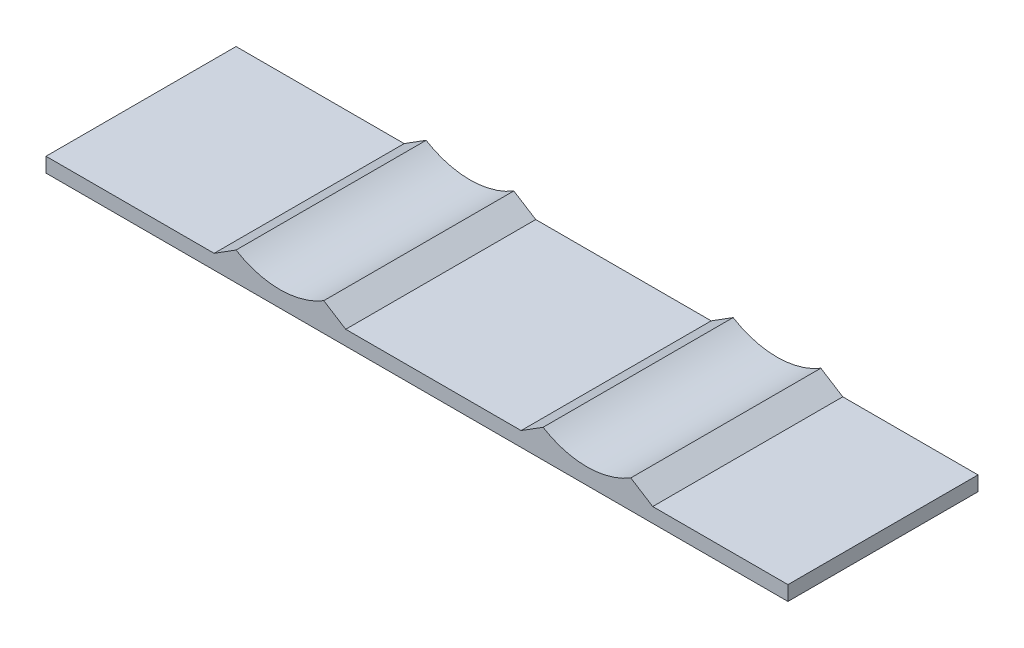
ISO-10303-21;
HEADER;
FILE_DESCRIPTION(('STEP AP214'),'2;1');
FILE_NAME('part.step','',(''),(''),'','','');
FILE_SCHEMA(('AUTOMOTIVE_DESIGN { 1 0 10303 214 1 1 1 1 }'));
ENDSEC;
DATA;
#1=APPLICATION_CONTEXT('core data for automotive mechanical design processes');
#2=APPLICATION_PROTOCOL_DEFINITION('international standard','automotive_design',2000,#1);
#3=PRODUCT_CONTEXT('',#1,'mechanical');
#4=PRODUCT('Part','Part','',(#3));
#5=PRODUCT_RELATED_PRODUCT_CATEGORY('part','',(#4));
#6=PRODUCT_DEFINITION_FORMATION('','',#4);
#7=PRODUCT_DEFINITION_CONTEXT('part definition',#1,'design');
#8=PRODUCT_DEFINITION('design','',#6,#7);
#9=PRODUCT_DEFINITION_SHAPE('','',#8);
#10=(LENGTH_UNIT() NAMED_UNIT(*) SI_UNIT(.MILLI.,.METRE.));
#11=(NAMED_UNIT(*) PLANE_ANGLE_UNIT() SI_UNIT($,.RADIAN.));
#12=(NAMED_UNIT(*) SI_UNIT($,.STERADIAN.) SOLID_ANGLE_UNIT());
#13=UNCERTAINTY_MEASURE_WITH_UNIT(LENGTH_MEASURE(1.E-05),#10,'distance_accuracy_value','');
#14=(GEOMETRIC_REPRESENTATION_CONTEXT(3) GLOBAL_UNCERTAINTY_ASSIGNED_CONTEXT((#13)) GLOBAL_UNIT_ASSIGNED_CONTEXT((#10,
#11,#12)) REPRESENTATION_CONTEXT('',''));
#15=CARTESIAN_POINT('',(0.,0.,0.));
#16=DIRECTION('',(0.,0.,1.));
#17=DIRECTION('',(1.,0.,0.));
#18=AXIS2_PLACEMENT_3D('',#15,#16,#17);
#19=CARTESIAN_POINT('',(0.,2.,26.));
#20=DIRECTION('',(1.,0.,0.));
#21=DIRECTION('',(0.,0.,-1.));
#22=AXIS2_PLACEMENT_3D('',#19,#20,#21);
#23=PLANE('',#22);
#24=DIRECTION('',(0.,-1.,0.));
#25=VECTOR('',#24,1.);
#26=CARTESIAN_POINT('',(0.,2.,0.));
#27=LINE('',#26,#25);
#28=CARTESIAN_POINT('',(0.,2.,0.));
#29=VERTEX_POINT('',#28);
#30=CARTESIAN_POINT('',(0.,0.,0.));
#31=VERTEX_POINT('',#30);
#32=EDGE_CURVE('E153',#29,#31,#27,.T.);
#33=ORIENTED_EDGE('',*,*,#32,.T.);
#34=DIRECTION('',(0.,0.,-1.));
#35=VECTOR('',#34,1.);
#36=CARTESIAN_POINT('',(0.,0.,26.));
#37=LINE('',#36,#35);
#38=CARTESIAN_POINT('',(0.,0.,26.));
#39=VERTEX_POINT('',#38);
#40=EDGE_CURVE('E11',#39,#31,#37,.T.);
#41=ORIENTED_EDGE('',*,*,#40,.F.);
#42=DIRECTION('',(0.,-1.,0.));
#43=VECTOR('',#42,1.);
#44=CARTESIAN_POINT('',(0.,2.,26.));
#45=LINE('',#44,#43);
#46=CARTESIAN_POINT('',(0.,2.,26.));
#47=VERTEX_POINT('',#46);
#48=EDGE_CURVE('E175',#47,#39,#45,.T.);
#49=ORIENTED_EDGE('',*,*,#48,.F.);
#50=DIRECTION('',(0.,0.,-1.));
#51=VECTOR('',#50,1.);
#52=CARTESIAN_POINT('',(0.,2.,26.));
#53=LINE('',#52,#51);
#54=EDGE_CURVE('E149',#47,#29,#53,.T.);
#55=ORIENTED_EDGE('',*,*,#54,.T.);
#56=EDGE_LOOP('',(#33,#41,#49,#55));
#57=FACE_BOUND('',#56,.T.);
#58=ADVANCED_FACE('F33',(#57),#23,.F.);
#59=CARTESIAN_POINT('',(0.,0.,26.));
#60=DIRECTION('',(0.,1.,0.));
#61=DIRECTION('',(0.,0.,1.));
#62=AXIS2_PLACEMENT_3D('',#59,#60,#61);
#63=PLANE('',#62);
#64=DIRECTION('',(1.,0.,0.));
#65=VECTOR('',#64,1.);
#66=CARTESIAN_POINT('',(0.,0.,0.));
#67=LINE('',#66,#65);
#68=CARTESIAN_POINT('',(101.5,0.,0.));
#69=VERTEX_POINT('',#68);
#70=EDGE_CURVE('E156',#31,#69,#67,.T.);
#71=ORIENTED_EDGE('',*,*,#70,.T.);
#72=DIRECTION('',(0.,0.,-1.));
#73=VECTOR('',#72,1.);
#74=CARTESIAN_POINT('',(101.5,0.,26.));
#75=LINE('',#74,#73);
#76=CARTESIAN_POINT('',(101.5,0.,26.));
#77=VERTEX_POINT('',#76);
#78=EDGE_CURVE('E41',#77,#69,#75,.T.);
#79=ORIENTED_EDGE('',*,*,#78,.F.);
#80=DIRECTION('',(1.,0.,0.));
#81=VECTOR('',#80,1.);
#82=CARTESIAN_POINT('',(0.,0.,26.));
#83=LINE('',#82,#81);
#84=EDGE_CURVE('E104',#39,#77,#83,.T.);
#85=ORIENTED_EDGE('',*,*,#84,.F.);
#86=ORIENTED_EDGE('',*,*,#40,.T.);
#87=EDGE_LOOP('',(#71,#79,#85,#86));
#88=FACE_BOUND('',#87,.T.);
#89=ADVANCED_FACE('F253',(#88),#63,.F.);
#90=CARTESIAN_POINT('',(101.5,0.,26.));
#91=DIRECTION('',(-1.,0.,0.));
#92=DIRECTION('',(0.,0.,1.));
#93=AXIS2_PLACEMENT_3D('',#90,#91,#92);
#94=PLANE('',#93);
#95=DIRECTION('',(0.,1.,0.));
#96=VECTOR('',#95,1.);
#97=CARTESIAN_POINT('',(101.5,0.,0.));
#98=LINE('',#97,#96);
#99=CARTESIAN_POINT('',(101.5,2.,0.));
#100=VERTEX_POINT('',#99);
#101=EDGE_CURVE('E158',#69,#100,#98,.T.);
#102=ORIENTED_EDGE('',*,*,#101,.T.);
#103=DIRECTION('',(0.,0.,-1.));
#104=VECTOR('',#103,1.);
#105=CARTESIAN_POINT('',(101.5,2.,26.));
#106=LINE('',#105,#104);
#107=CARTESIAN_POINT('',(101.5,2.,26.));
#108=VERTEX_POINT('',#107);
#109=EDGE_CURVE('E194',#108,#100,#106,.T.);
#110=ORIENTED_EDGE('',*,*,#109,.F.);
#111=DIRECTION('',(0.,1.,0.));
#112=VECTOR('',#111,1.);
#113=CARTESIAN_POINT('',(101.5,0.,26.));
#114=LINE('',#113,#112);
#115=EDGE_CURVE('E202',#77,#108,#114,.T.);
#116=ORIENTED_EDGE('',*,*,#115,.F.);
#117=ORIENTED_EDGE('',*,*,#78,.T.);
#118=EDGE_LOOP('',(#102,#110,#116,#117));
#119=FACE_BOUND('',#118,.T.);
#120=ADVANCED_FACE('F200',(#119),#94,.F.);
#121=CARTESIAN_POINT('',(101.5,2.,26.));
#122=DIRECTION('',(0.,-1.,0.));
#123=DIRECTION('',(1.,0.,0.));
#124=AXIS2_PLACEMENT_3D('',#121,#122,#123);
#125=PLANE('',#124);
#126=DIRECTION('',(-1.,0.,0.));
#127=VECTOR('',#126,1.);
#128=CARTESIAN_POINT('',(101.5,2.,0.));
#129=LINE('',#128,#127);
#130=CARTESIAN_POINT('',(83.,2.,0.));
#131=VERTEX_POINT('',#130);
#132=EDGE_CURVE('E160',#100,#131,#129,.T.);
#133=ORIENTED_EDGE('',*,*,#132,.T.);
#134=DIRECTION('',(0.,0.,-1.));
#135=VECTOR('',#134,1.);
#136=CARTESIAN_POINT('',(83.,2.,26.));
#137=LINE('',#136,#135);
#138=CARTESIAN_POINT('',(83.,2.,26.));
#139=VERTEX_POINT('',#138);
#140=EDGE_CURVE('E191',#139,#131,#137,.T.);
#141=ORIENTED_EDGE('',*,*,#140,.F.);
#142=DIRECTION('',(-1.,0.,0.));
#143=VECTOR('',#142,1.);
#144=CARTESIAN_POINT('',(101.5,2.,26.));
#145=LINE('',#144,#143);
#146=EDGE_CURVE('E220',#108,#139,#145,.T.);
#147=ORIENTED_EDGE('',*,*,#146,.F.);
#148=ORIENTED_EDGE('',*,*,#109,.T.);
#149=EDGE_LOOP('',(#133,#141,#147,#148));
#150=FACE_BOUND('',#149,.T.);
#151=ADVANCED_FACE('F211',(#150),#125,.F.);
#152=CARTESIAN_POINT('',(80.,3.88929156482572,26.));
#153=DIRECTION('',(-0.532894602279916,-0.846181625220573,0.));
#154=DIRECTION('',(0.846181625220573,-0.532894602279916,0.));
#155=AXIS2_PLACEMENT_3D('',#152,#153,#154);
#156=PLANE('',#155);
#157=DIRECTION('',(-0.846181625220573,0.532894602279916,0.));
#158=VECTOR('',#157,1.);
#159=CARTESIAN_POINT('',(80.,3.88929156482572,0.));
#160=LINE('',#159,#158);
#161=CARTESIAN_POINT('',(80.,3.88929156482572,0.));
#162=VERTEX_POINT('',#161);
#163=EDGE_CURVE('E162',#131,#162,#160,.T.);
#164=ORIENTED_EDGE('',*,*,#163,.T.);
#165=DIRECTION('',(0.,0.,-1.));
#166=VECTOR('',#165,1.);
#167=CARTESIAN_POINT('',(80.,3.88929156482572,26.));
#168=LINE('',#167,#166);
#169=CARTESIAN_POINT('',(80.,3.88929156482572,26.));
#170=VERTEX_POINT('',#169);
#171=EDGE_CURVE('E188',#170,#162,#168,.T.);
#172=ORIENTED_EDGE('',*,*,#171,.F.);
#173=DIRECTION('',(-0.846181625220573,0.532894602279916,0.));
#174=VECTOR('',#173,1.);
#175=CARTESIAN_POINT('',(80.,3.88929156482572,26.));
#176=LINE('',#175,#174);
#177=EDGE_CURVE('E217',#139,#170,#176,.T.);
#178=ORIENTED_EDGE('',*,*,#177,.F.);
#179=ORIENTED_EDGE('',*,*,#140,.T.);
#180=EDGE_LOOP('',(#164,#172,#178,#179));
#181=FACE_BOUND('',#180,.T.);
#182=ADVANCED_FACE('F215',(#181),#156,.F.);
#183=CARTESIAN_POINT('',(74.,13.7,26.));
#184=DIRECTION('',(0.,0.,-1.));
#185=DIRECTION('',(-1.,0.,0.));
#186=AXIS2_PLACEMENT_3D('',#183,#184,#185);
#187=CYLINDRICAL_SURFACE('',#186,11.5);
#188=CARTESIAN_POINT('',(74.,13.7,0.));
#189=DIRECTION('',(0.,0.,-1.));
#190=DIRECTION('',(1.,0.,0.));
#191=AXIS2_PLACEMENT_3D('',#188,#189,#190);
#192=CIRCLE('',#191,11.5);
#193=CARTESIAN_POINT('',(68.,3.88929156482572,0.));
#194=VERTEX_POINT('',#193);
#195=EDGE_CURVE('E164',#162,#194,#192,.T.);
#196=ORIENTED_EDGE('',*,*,#195,.T.);
#197=DIRECTION('',(0.,0.,-1.));
#198=VECTOR('',#197,1.);
#199=CARTESIAN_POINT('',(68.,3.88929156482572,26.));
#200=LINE('',#199,#198);
#201=CARTESIAN_POINT('',(68.,3.88929156482572,26.));
#202=VERTEX_POINT('',#201);
#203=EDGE_CURVE('E185',#202,#194,#200,.T.);
#204=ORIENTED_EDGE('',*,*,#203,.F.);
#205=CARTESIAN_POINT('',(74.,13.7,26.));
#206=DIRECTION('',(0.,0.,-1.));
#207=DIRECTION('',(1.,0.,0.));
#208=AXIS2_PLACEMENT_3D('',#205,#206,#207);
#209=CIRCLE('',#208,11.5);
#210=EDGE_CURVE('E219',#170,#202,#209,.T.);
#211=ORIENTED_EDGE('',*,*,#210,.F.);
#212=ORIENTED_EDGE('',*,*,#171,.T.);
#213=EDGE_LOOP('',(#196,#204,#211,#212));
#214=FACE_BOUND('',#213,.T.);
#215=ADVANCED_FACE('F266',(#214),#187,.F.);
#216=CARTESIAN_POINT('',(68.,3.88929156482571,26.));
#217=DIRECTION('',(0.532894602279911,-0.846181625220576,0.));
#218=DIRECTION('',(0.846181625220576,0.532894602279911,0.));
#219=AXIS2_PLACEMENT_3D('',#216,#217,#218);
#220=PLANE('',#219);
#221=DIRECTION('',(-0.846181625220576,-0.532894602279911,0.));
#222=VECTOR('',#221,1.);
#223=CARTESIAN_POINT('',(68.,3.88929156482571,0.));
#224=LINE('',#223,#222);
#225=CARTESIAN_POINT('',(65.,2.,0.));
#226=VERTEX_POINT('',#225);
#227=EDGE_CURVE('E166',#194,#226,#224,.T.);
#228=ORIENTED_EDGE('',*,*,#227,.T.);
#229=DIRECTION('',(0.,0.,-1.));
#230=VECTOR('',#229,1.);
#231=CARTESIAN_POINT('',(65.,2.,26.));
#232=LINE('',#231,#230);
#233=CARTESIAN_POINT('',(65.,2.,26.));
#234=VERTEX_POINT('',#233);
#235=EDGE_CURVE('E182',#234,#226,#232,.T.);
#236=ORIENTED_EDGE('',*,*,#235,.F.);
#237=DIRECTION('',(-0.846181625220576,-0.532894602279911,0.));
#238=VECTOR('',#237,1.);
#239=CARTESIAN_POINT('',(68.,3.88929156482571,26.));
#240=LINE('',#239,#238);
#241=EDGE_CURVE('E222',#202,#234,#240,.T.);
#242=ORIENTED_EDGE('',*,*,#241,.F.);
#243=ORIENTED_EDGE('',*,*,#203,.T.);
#244=EDGE_LOOP('',(#228,#236,#242,#243));
#245=FACE_BOUND('',#244,.T.);
#246=ADVANCED_FACE('F269',(#245),#220,.F.);
#247=CARTESIAN_POINT('',(65.,2.,26.));
#248=DIRECTION('',(0.,-1.,0.));
#249=DIRECTION('',(1.,0.,0.));
#250=AXIS2_PLACEMENT_3D('',#247,#248,#249);
#251=PLANE('',#250);
#252=DIRECTION('',(-1.,0.,0.));
#253=VECTOR('',#252,1.);
#254=CARTESIAN_POINT('',(65.,2.,0.));
#255=LINE('',#254,#253);
#256=CARTESIAN_POINT('',(41.,1.99999999999999,0.));
#257=VERTEX_POINT('',#256);
#258=EDGE_CURVE('E168',#226,#257,#255,.T.);
#259=ORIENTED_EDGE('',*,*,#258,.T.);
#260=DIRECTION('',(0.,0.,-1.));
#261=VECTOR('',#260,1.);
#262=CARTESIAN_POINT('',(41.,1.99999999999999,26.));
#263=LINE('',#262,#261);
#264=CARTESIAN_POINT('',(41.,1.99999999999999,26.));
#265=VERTEX_POINT('',#264);
#266=EDGE_CURVE('E179',#265,#257,#263,.T.);
#267=ORIENTED_EDGE('',*,*,#266,.F.);
#268=DIRECTION('',(-1.,0.,0.));
#269=VECTOR('',#268,1.);
#270=CARTESIAN_POINT('',(65.,2.,26.));
#271=LINE('',#270,#269);
#272=EDGE_CURVE('E228',#234,#265,#271,.T.);
#273=ORIENTED_EDGE('',*,*,#272,.F.);
#274=ORIENTED_EDGE('',*,*,#235,.T.);
#275=EDGE_LOOP('',(#259,#267,#273,#274));
#276=FACE_BOUND('',#275,.T.);
#277=ADVANCED_FACE('F234',(#276),#251,.F.);
#278=CARTESIAN_POINT('',(38.,3.88929156482571,26.));
#279=DIRECTION('',(-0.532894602279913,-0.846181625220575,0.));
#280=DIRECTION('',(0.846181625220575,-0.532894602279913,0.));
#281=AXIS2_PLACEMENT_3D('',#278,#279,#280);
#282=PLANE('',#281);
#283=DIRECTION('',(-0.846181625220575,0.532894602279913,0.));
#284=VECTOR('',#283,1.);
#285=CARTESIAN_POINT('',(38.,3.88929156482571,0.));
#286=LINE('',#285,#284);
#287=CARTESIAN_POINT('',(38.,3.88929156482571,0.));
#288=VERTEX_POINT('',#287);
#289=EDGE_CURVE('E170',#257,#288,#286,.T.);
#290=ORIENTED_EDGE('',*,*,#289,.T.);
#291=DIRECTION('',(0.,0.,-1.));
#292=VECTOR('',#291,1.);
#293=CARTESIAN_POINT('',(38.,3.88929156482571,26.));
#294=LINE('',#293,#292);
#295=CARTESIAN_POINT('',(38.,3.88929156482571,26.));
#296=VERTEX_POINT('',#295);
#297=EDGE_CURVE('E144',#296,#288,#294,.T.);
#298=ORIENTED_EDGE('',*,*,#297,.F.);
#299=DIRECTION('',(-0.846181625220575,0.532894602279913,0.));
#300=VECTOR('',#299,1.);
#301=CARTESIAN_POINT('',(38.,3.88929156482571,26.));
#302=LINE('',#301,#300);
#303=EDGE_CURVE('E135',#265,#296,#302,.T.);
#304=ORIENTED_EDGE('',*,*,#303,.F.);
#305=ORIENTED_EDGE('',*,*,#266,.T.);
#306=EDGE_LOOP('',(#290,#298,#304,#305));
#307=FACE_BOUND('',#306,.T.);
#308=ADVANCED_FACE('F238',(#307),#282,.F.);
#309=CARTESIAN_POINT('',(32.,13.7,26.));
#310=DIRECTION('',(0.,0.,-1.));
#311=DIRECTION('',(-1.,0.,0.));
#312=AXIS2_PLACEMENT_3D('',#309,#310,#311);
#313=CYLINDRICAL_SURFACE('',#312,11.5);
#314=CARTESIAN_POINT('',(32.,13.7,0.));
#315=DIRECTION('',(0.,0.,-1.));
#316=DIRECTION('',(1.,0.,0.));
#317=AXIS2_PLACEMENT_3D('',#314,#315,#316);
#318=CIRCLE('',#317,11.5);
#319=CARTESIAN_POINT('',(26.,3.88929156482571,0.));
#320=VERTEX_POINT('',#319);
#321=EDGE_CURVE('E143',#288,#320,#318,.T.);
#322=ORIENTED_EDGE('',*,*,#321,.T.);
#323=DIRECTION('',(0.,0.,-1.));
#324=VECTOR('',#323,1.);
#325=CARTESIAN_POINT('',(26.,3.88929156482571,26.));
#326=LINE('',#325,#324);
#327=CARTESIAN_POINT('',(26.,3.88929156482571,26.));
#328=VERTEX_POINT('',#327);
#329=EDGE_CURVE('E140',#328,#320,#326,.T.);
#330=ORIENTED_EDGE('',*,*,#329,.F.);
#331=CARTESIAN_POINT('',(32.,13.7,26.));
#332=DIRECTION('',(0.,0.,-1.));
#333=DIRECTION('',(1.,0.,0.));
#334=AXIS2_PLACEMENT_3D('',#331,#332,#333);
#335=CIRCLE('',#334,11.5);
#336=EDGE_CURVE('E129',#296,#328,#335,.T.);
#337=ORIENTED_EDGE('',*,*,#336,.F.);
#338=ORIENTED_EDGE('',*,*,#297,.T.);
#339=EDGE_LOOP('',(#322,#330,#337,#338));
#340=FACE_BOUND('',#339,.T.);
#341=ADVANCED_FACE('F141',(#340),#313,.F.);
#342=CARTESIAN_POINT('',(26.,3.88929156482571,26.));
#343=DIRECTION('',(0.532894602279911,-0.846181625220576,0.));
#344=DIRECTION('',(0.846181625220576,0.532894602279911,0.));
#345=AXIS2_PLACEMENT_3D('',#342,#343,#344);
#346=PLANE('',#345);
#347=DIRECTION('',(-0.846181625220576,-0.532894602279911,0.));
#348=VECTOR('',#347,1.);
#349=CARTESIAN_POINT('',(26.,3.88929156482571,0.));
#350=LINE('',#349,#348);
#351=CARTESIAN_POINT('',(23.,1.99999999999999,0.));
#352=VERTEX_POINT('',#351);
#353=EDGE_CURVE('E90',#320,#352,#350,.T.);
#354=ORIENTED_EDGE('',*,*,#353,.T.);
#355=DIRECTION('',(0.,0.,-1.));
#356=VECTOR('',#355,1.);
#357=CARTESIAN_POINT('',(23.,1.99999999999999,26.));
#358=LINE('',#357,#356);
#359=CARTESIAN_POINT('',(23.,1.99999999999999,26.));
#360=VERTEX_POINT('',#359);
#361=EDGE_CURVE('E145',#360,#352,#358,.T.);
#362=ORIENTED_EDGE('',*,*,#361,.F.);
#363=DIRECTION('',(-0.846181625220576,-0.532894602279911,0.));
#364=VECTOR('',#363,1.);
#365=CARTESIAN_POINT('',(26.,3.88929156482571,26.));
#366=LINE('',#365,#364);
#367=EDGE_CURVE('E133',#328,#360,#366,.T.);
#368=ORIENTED_EDGE('',*,*,#367,.F.);
#369=ORIENTED_EDGE('',*,*,#329,.T.);
#370=EDGE_LOOP('',(#354,#362,#368,#369));
#371=FACE_BOUND('',#370,.T.);
#372=ADVANCED_FACE('F147',(#371),#346,.F.);
#373=CARTESIAN_POINT('',(23.,1.99999999999999,26.));
#374=DIRECTION('',(0.,-1.,0.));
#375=DIRECTION('',(1.,0.,0.));
#376=AXIS2_PLACEMENT_3D('',#373,#374,#375);
#377=PLANE('',#376);
#378=DIRECTION('',(-1.,0.,0.));
#379=VECTOR('',#378,1.);
#380=CARTESIAN_POINT('',(23.,1.99999999999999,0.));
#381=LINE('',#380,#379);
#382=EDGE_CURVE('E96',#352,#29,#381,.T.);
#383=ORIENTED_EDGE('',*,*,#382,.T.);
#384=ORIENTED_EDGE('',*,*,#54,.F.);
#385=DIRECTION('',(-1.,0.,0.));
#386=VECTOR('',#385,1.);
#387=CARTESIAN_POINT('',(23.,1.99999999999999,26.));
#388=LINE('',#387,#386);
#389=EDGE_CURVE('E49',#360,#47,#388,.T.);
#390=ORIENTED_EDGE('',*,*,#389,.F.);
#391=ORIENTED_EDGE('',*,*,#361,.T.);
#392=EDGE_LOOP('',(#383,#384,#390,#391));
#393=FACE_BOUND('',#392,.T.);
#394=ADVANCED_FACE('F242',(#393),#377,.F.);
#395=CARTESIAN_POINT('',(74.,13.7,26.));
#396=DIRECTION('',(0.,0.,1.));
#397=DIRECTION('',(1.,0.,0.));
#398=AXIS2_PLACEMENT_3D('',#395,#396,#397);
#399=PLANE('',#398);
#400=ORIENTED_EDGE('',*,*,#48,.T.);
#401=ORIENTED_EDGE('',*,*,#84,.T.);
#402=ORIENTED_EDGE('',*,*,#115,.T.);
#403=ORIENTED_EDGE('',*,*,#146,.T.);
#404=ORIENTED_EDGE('',*,*,#177,.T.);
#405=ORIENTED_EDGE('',*,*,#210,.T.);
#406=ORIENTED_EDGE('',*,*,#241,.T.);
#407=ORIENTED_EDGE('',*,*,#272,.T.);
#408=ORIENTED_EDGE('',*,*,#303,.T.);
#409=ORIENTED_EDGE('',*,*,#336,.T.);
#410=ORIENTED_EDGE('',*,*,#367,.T.);
#411=ORIENTED_EDGE('',*,*,#389,.T.);
#412=EDGE_LOOP('',(#400,#401,#402,#403,#404,#405,#406,#407,#408,#409,#410,#411));
#413=FACE_BOUND('',#412,.T.);
#414=ADVANCED_FACE('F131',(#413),#399,.T.);
#415=CARTESIAN_POINT('',(74.,13.7,0.));
#416=DIRECTION('',(0.,0.,1.));
#417=DIRECTION('',(1.,0.,0.));
#418=AXIS2_PLACEMENT_3D('',#415,#416,#417);
#419=PLANE('',#418);
#420=ORIENTED_EDGE('',*,*,#32,.F.);
#421=ORIENTED_EDGE('',*,*,#382,.F.);
#422=ORIENTED_EDGE('',*,*,#353,.F.);
#423=ORIENTED_EDGE('',*,*,#321,.F.);
#424=ORIENTED_EDGE('',*,*,#289,.F.);
#425=ORIENTED_EDGE('',*,*,#258,.F.);
#426=ORIENTED_EDGE('',*,*,#227,.F.);
#427=ORIENTED_EDGE('',*,*,#195,.F.);
#428=ORIENTED_EDGE('',*,*,#163,.F.);
#429=ORIENTED_EDGE('',*,*,#132,.F.);
#430=ORIENTED_EDGE('',*,*,#101,.F.);
#431=ORIENTED_EDGE('',*,*,#70,.F.);
#432=EDGE_LOOP('',(#420,#421,#422,#423,#424,#425,#426,#427,#428,#429,#430,#431));
#433=FACE_BOUND('',#432,.T.);
#434=ADVANCED_FACE('F206',(#433),#419,.F.);
#435=CLOSED_SHELL('',(#58,#89,#120,#151,#182,#215,#246,#277,#308,#341,#372,#394,#414,#434));
#436=MANIFOLD_SOLID_BREP('B2',#435);
#437=ADVANCED_BREP_SHAPE_REPRESENTATION('',(#18,#436),#14);
#438=SHAPE_DEFINITION_REPRESENTATION(#9,#437);
ENDSEC;
END-ISO-10303-21;
